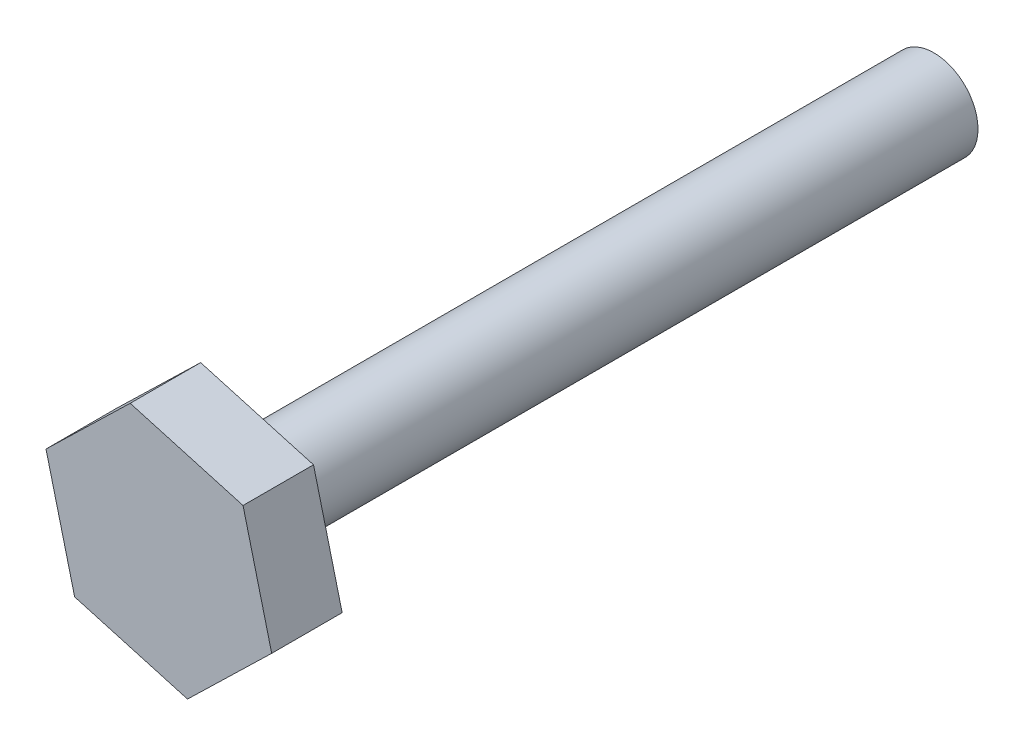
ISO-10303-21;
HEADER;
FILE_DESCRIPTION(('STEP AP214'),'2;1');
FILE_NAME('part.step','',(''),(''),'','','');
FILE_SCHEMA(('AUTOMOTIVE_DESIGN { 1 0 10303 214 1 1 1 1 }'));
ENDSEC;
DATA;
#1=APPLICATION_CONTEXT('core data for automotive mechanical design processes');
#2=APPLICATION_PROTOCOL_DEFINITION('international standard','automotive_design',2000,#1);
#3=PRODUCT_CONTEXT('',#1,'mechanical');
#4=PRODUCT('Part','Part','',(#3));
#5=PRODUCT_RELATED_PRODUCT_CATEGORY('part','',(#4));
#6=PRODUCT_DEFINITION_FORMATION('','',#4);
#7=PRODUCT_DEFINITION_CONTEXT('part definition',#1,'design');
#8=PRODUCT_DEFINITION('design','',#6,#7);
#9=PRODUCT_DEFINITION_SHAPE('','',#8);
#10=(LENGTH_UNIT() NAMED_UNIT(*) SI_UNIT(.MILLI.,.METRE.));
#11=(NAMED_UNIT(*) PLANE_ANGLE_UNIT() SI_UNIT($,.RADIAN.));
#12=(NAMED_UNIT(*) SI_UNIT($,.STERADIAN.) SOLID_ANGLE_UNIT());
#13=UNCERTAINTY_MEASURE_WITH_UNIT(LENGTH_MEASURE(1.E-05),#10,'distance_accuracy_value','');
#14=(GEOMETRIC_REPRESENTATION_CONTEXT(3) GLOBAL_UNCERTAINTY_ASSIGNED_CONTEXT((#13)) GLOBAL_UNIT_ASSIGNED_CONTEXT((#10,
#11,#12)) REPRESENTATION_CONTEXT('',''));
#15=CARTESIAN_POINT('',(0.,0.,0.));
#16=DIRECTION('',(0.,0.,1.));
#17=DIRECTION('',(1.,0.,0.));
#18=AXIS2_PLACEMENT_3D('',#15,#16,#17);
#19=CARTESIAN_POINT('',(0.,0.,20.));
#20=DIRECTION('',(0.,0.,-1.));
#21=DIRECTION('',(-1.,0.,0.));
#22=AXIS2_PLACEMENT_3D('',#19,#20,#21);
#23=CYLINDRICAL_SURFACE('',#22,1.25);
#24=CARTESIAN_POINT('',(0.,0.,20.));
#25=DIRECTION('',(0.,0.,1.));
#26=DIRECTION('',(1.,0.,0.));
#27=AXIS2_PLACEMENT_3D('',#24,#25,#26);
#28=CIRCLE('',#27,1.25);
#29=CARTESIAN_POINT('',(1.25,0.,20.));
#30=VERTEX_POINT('',#29);
#31=EDGE_CURVE('E11',#30,#30,#28,.T.);
#32=ORIENTED_EDGE('',*,*,#31,.F.);
#33=EDGE_LOOP('',(#32));
#34=FACE_BOUND('',#33,.T.);
#35=CARTESIAN_POINT('',(0.,0.,0.));
#36=DIRECTION('',(0.,0.,1.));
#37=DIRECTION('',(1.,0.,0.));
#38=AXIS2_PLACEMENT_3D('',#35,#36,#37);
#39=CIRCLE('',#38,1.25);
#40=CARTESIAN_POINT('',(1.25,0.,0.));
#41=VERTEX_POINT('',#40);
#42=EDGE_CURVE('E37',#41,#41,#39,.T.);
#43=ORIENTED_EDGE('',*,*,#42,.T.);
#44=EDGE_LOOP('',(#43));
#45=FACE_BOUND('',#44,.T.);
#46=ADVANCED_FACE('F34',(#34,#45),#23,.T.);
#47=CARTESIAN_POINT('',(0.,0.,0.));
#48=DIRECTION('',(0.,0.,1.));
#49=DIRECTION('',(1.,0.,0.));
#50=AXIS2_PLACEMENT_3D('',#47,#48,#49);
#51=PLANE('',#50);
#52=ORIENTED_EDGE('',*,*,#42,.F.);
#53=EDGE_LOOP('',(#52));
#54=FACE_BOUND('',#53,.T.);
#55=ADVANCED_FACE('F142',(#54),#51,.F.);
#56=CARTESIAN_POINT('',(0.,0.,20.));
#57=DIRECTION('',(0.,0.,1.));
#58=DIRECTION('',(1.,0.,0.));
#59=AXIS2_PLACEMENT_3D('',#56,#57,#58);
#60=PLANE('',#59);
#61=DIRECTION('',(-0.244196942198812,0.969725658844165,0.));
#62=VECTOR('',#61,1.);
#63=CARTESIAN_POINT('',(3.20276571956048,-0.910254396923229,20.));
#64=LINE('',#63,#62);
#65=CARTESIAN_POINT('',(3.20276571956048,-0.910254396923229,20.));
#66=VERTEX_POINT('',#65);
#67=CARTESIAN_POINT('',(2.38968629142224,2.31854927704771,20.));
#68=VERTEX_POINT('',#67);
#69=EDGE_CURVE('E119',#66,#68,#64,.T.);
#70=ORIENTED_EDGE('',*,*,#69,.F.);
#71=DIRECTION('',(0.717708584161243,0.696343584892734,0.));
#72=VECTOR('',#71,1.);
#73=CARTESIAN_POINT('',(0.81307942813824,-3.22880367397094,20.));
#74=LINE('',#73,#72);
#75=CARTESIAN_POINT('',(0.81307942813824,-3.22880367397094,20.));
#76=VERTEX_POINT('',#75);
#77=EDGE_CURVE('E79',#76,#66,#74,.T.);
#78=ORIENTED_EDGE('',*,*,#77,.F.);
#79=DIRECTION('',(0.961905526360055,-0.273382073951431,0.));
#80=VECTOR('',#79,1.);
#81=CARTESIAN_POINT('',(-2.38968629142224,-2.31854927704771,20.));
#82=LINE('',#81,#80);
#83=CARTESIAN_POINT('',(-2.38968629142224,-2.31854927704771,20.));
#84=VERTEX_POINT('',#83);
#85=EDGE_CURVE('E73',#84,#76,#82,.T.);
#86=ORIENTED_EDGE('',*,*,#85,.F.);
#87=DIRECTION('',(0.244196942198812,-0.969725658844165,0.));
#88=VECTOR('',#87,1.);
#89=CARTESIAN_POINT('',(-3.20276571956048,0.910254396923227,20.));
#90=LINE('',#89,#88);
#91=CARTESIAN_POINT('',(-3.20276571956048,0.910254396923227,20.));
#92=VERTEX_POINT('',#91);
#93=EDGE_CURVE('E109',#92,#84,#90,.T.);
#94=ORIENTED_EDGE('',*,*,#93,.F.);
#95=DIRECTION('',(-0.717708584161243,-0.696343584892734,0.));
#96=VECTOR('',#95,1.);
#97=CARTESIAN_POINT('',(-0.813079428138239,3.22880367397094,20.));
#98=LINE('',#97,#96);
#99=CARTESIAN_POINT('',(-0.813079428138239,3.22880367397094,20.));
#100=VERTEX_POINT('',#99);
#101=EDGE_CURVE('E124',#100,#92,#98,.T.);
#102=ORIENTED_EDGE('',*,*,#101,.F.);
#103=DIRECTION('',(-0.961905526360055,0.273382073951432,0.));
#104=VECTOR('',#103,1.);
#105=CARTESIAN_POINT('',(2.38968629142224,2.31854927704771,20.));
#106=LINE('',#105,#104);
#107=EDGE_CURVE('E122',#68,#100,#106,.T.);
#108=ORIENTED_EDGE('',*,*,#107,.F.);
#109=EDGE_LOOP('',(#70,#78,#86,#94,#102,#108));
#110=FACE_BOUND('',#109,.T.);
#111=ORIENTED_EDGE('',*,*,#31,.T.);
#112=EDGE_LOOP('',(#111));
#113=FACE_BOUND('',#112,.T.);
#114=ADVANCED_FACE('F144',(#110,#113),#60,.F.);
#115=CARTESIAN_POINT('',(3.20276571956048,-0.910254396923229,22.));
#116=DIRECTION('',(-0.969725658844165,-0.244196942198812,0.));
#117=DIRECTION('',(0.244196942198812,-0.969725658844165,0.));
#118=AXIS2_PLACEMENT_3D('',#115,#116,#117);
#119=PLANE('',#118);
#120=ORIENTED_EDGE('',*,*,#69,.T.);
#121=DIRECTION('',(0.,0.,-1.));
#122=VECTOR('',#121,1.);
#123=CARTESIAN_POINT('',(2.38968629142224,2.31854927704771,22.));
#124=LINE('',#123,#122);
#125=CARTESIAN_POINT('',(2.38968629142224,2.31854927704771,22.));
#126=VERTEX_POINT('',#125);
#127=EDGE_CURVE('E136',#126,#68,#124,.T.);
#128=ORIENTED_EDGE('',*,*,#127,.F.);
#129=DIRECTION('',(-0.244196942198812,0.969725658844165,0.));
#130=VECTOR('',#129,1.);
#131=CARTESIAN_POINT('',(3.20276571956048,-0.910254396923229,22.));
#132=LINE('',#131,#130);
#133=CARTESIAN_POINT('',(3.20276571956048,-0.910254396923229,22.));
#134=VERTEX_POINT('',#133);
#135=EDGE_CURVE('E129',#134,#126,#132,.T.);
#136=ORIENTED_EDGE('',*,*,#135,.F.);
#137=DIRECTION('',(0.,0.,-1.));
#138=VECTOR('',#137,1.);
#139=CARTESIAN_POINT('',(3.20276571956048,-0.910254396923229,22.));
#140=LINE('',#139,#138);
#141=EDGE_CURVE('E115',#134,#66,#140,.T.);
#142=ORIENTED_EDGE('',*,*,#141,.T.);
#143=EDGE_LOOP('',(#120,#128,#136,#142));
#144=FACE_BOUND('',#143,.T.);
#145=ADVANCED_FACE('F149',(#144),#119,.F.);
#146=CARTESIAN_POINT('',(2.38968629142224,2.31854927704771,22.));
#147=DIRECTION('',(-0.273382073951431,-0.961905526360055,0.));
#148=DIRECTION('',(0.961905526360055,-0.273382073951432,0.));
#149=AXIS2_PLACEMENT_3D('',#146,#147,#148);
#150=PLANE('',#149);
#151=ORIENTED_EDGE('',*,*,#107,.T.);
#152=DIRECTION('',(0.,0.,-1.));
#153=VECTOR('',#152,1.);
#154=CARTESIAN_POINT('',(-0.813079428138239,3.22880367397094,22.));
#155=LINE('',#154,#153);
#156=CARTESIAN_POINT('',(-0.813079428138239,3.22880367397094,22.));
#157=VERTEX_POINT('',#156);
#158=EDGE_CURVE('E133',#157,#100,#155,.T.);
#159=ORIENTED_EDGE('',*,*,#158,.F.);
#160=DIRECTION('',(-0.961905526360055,0.273382073951432,0.));
#161=VECTOR('',#160,1.);
#162=CARTESIAN_POINT('',(2.38968629142224,2.31854927704771,22.));
#163=LINE('',#162,#161);
#164=EDGE_CURVE('E88',#126,#157,#163,.T.);
#165=ORIENTED_EDGE('',*,*,#164,.F.);
#166=ORIENTED_EDGE('',*,*,#127,.T.);
#167=EDGE_LOOP('',(#151,#159,#165,#166));
#168=FACE_BOUND('',#167,.T.);
#169=ADVANCED_FACE('F156',(#168),#150,.F.);
#170=CARTESIAN_POINT('',(-0.813079428138239,3.22880367397094,22.));
#171=DIRECTION('',(0.696343584892734,-0.717708584161243,0.));
#172=DIRECTION('',(0.717708584161243,0.696343584892734,0.));
#173=AXIS2_PLACEMENT_3D('',#170,#171,#172);
#174=PLANE('',#173);
#175=ORIENTED_EDGE('',*,*,#101,.T.);
#176=DIRECTION('',(0.,0.,-1.));
#177=VECTOR('',#176,1.);
#178=CARTESIAN_POINT('',(-3.20276571956048,0.910254396923227,22.));
#179=LINE('',#178,#177);
#180=CARTESIAN_POINT('',(-3.20276571956048,0.910254396923227,22.));
#181=VERTEX_POINT('',#180);
#182=EDGE_CURVE('E110',#181,#92,#179,.T.);
#183=ORIENTED_EDGE('',*,*,#182,.F.);
#184=DIRECTION('',(-0.717708584161243,-0.696343584892734,0.));
#185=VECTOR('',#184,1.);
#186=CARTESIAN_POINT('',(-0.813079428138239,3.22880367397094,22.));
#187=LINE('',#186,#185);
#188=EDGE_CURVE('E101',#157,#181,#187,.T.);
#189=ORIENTED_EDGE('',*,*,#188,.F.);
#190=ORIENTED_EDGE('',*,*,#158,.T.);
#191=EDGE_LOOP('',(#175,#183,#189,#190));
#192=FACE_BOUND('',#191,.T.);
#193=ADVANCED_FACE('F160',(#192),#174,.F.);
#194=CARTESIAN_POINT('',(-3.20276571956048,0.910254396923227,22.));
#195=DIRECTION('',(0.969725658844165,0.244196942198812,0.));
#196=DIRECTION('',(-0.244196942198812,0.969725658844165,0.));
#197=AXIS2_PLACEMENT_3D('',#194,#195,#196);
#198=PLANE('',#197);
#199=ORIENTED_EDGE('',*,*,#93,.T.);
#200=DIRECTION('',(0.,0.,-1.));
#201=VECTOR('',#200,1.);
#202=CARTESIAN_POINT('',(-2.38968629142224,-2.31854927704771,22.));
#203=LINE('',#202,#201);
#204=CARTESIAN_POINT('',(-2.38968629142224,-2.31854927704771,22.));
#205=VERTEX_POINT('',#204);
#206=EDGE_CURVE('E106',#205,#84,#203,.T.);
#207=ORIENTED_EDGE('',*,*,#206,.F.);
#208=DIRECTION('',(0.244196942198812,-0.969725658844165,0.));
#209=VECTOR('',#208,1.);
#210=CARTESIAN_POINT('',(-3.20276571956048,0.910254396923227,22.));
#211=LINE('',#210,#209);
#212=EDGE_CURVE('E95',#181,#205,#211,.T.);
#213=ORIENTED_EDGE('',*,*,#212,.F.);
#214=ORIENTED_EDGE('',*,*,#182,.T.);
#215=EDGE_LOOP('',(#199,#207,#213,#214));
#216=FACE_BOUND('',#215,.T.);
#217=ADVANCED_FACE('F107',(#216),#198,.F.);
#218=CARTESIAN_POINT('',(-2.38968629142224,-2.31854927704771,22.));
#219=DIRECTION('',(0.273382073951431,0.961905526360055,0.));
#220=DIRECTION('',(-0.961905526360055,0.273382073951431,0.));
#221=AXIS2_PLACEMENT_3D('',#218,#219,#220);
#222=PLANE('',#221);
#223=ORIENTED_EDGE('',*,*,#85,.T.);
#224=DIRECTION('',(0.,0.,-1.));
#225=VECTOR('',#224,1.);
#226=CARTESIAN_POINT('',(0.81307942813824,-3.22880367397094,22.));
#227=LINE('',#226,#225);
#228=CARTESIAN_POINT('',(0.81307942813824,-3.22880367397094,22.));
#229=VERTEX_POINT('',#228);
#230=EDGE_CURVE('E111',#229,#76,#227,.T.);
#231=ORIENTED_EDGE('',*,*,#230,.F.);
#232=DIRECTION('',(0.961905526360055,-0.273382073951431,0.));
#233=VECTOR('',#232,1.);
#234=CARTESIAN_POINT('',(-2.38968629142224,-2.31854927704771,22.));
#235=LINE('',#234,#233);
#236=EDGE_CURVE('E99',#205,#229,#235,.T.);
#237=ORIENTED_EDGE('',*,*,#236,.F.);
#238=ORIENTED_EDGE('',*,*,#206,.T.);
#239=EDGE_LOOP('',(#223,#231,#237,#238));
#240=FACE_BOUND('',#239,.T.);
#241=ADVANCED_FACE('F113',(#240),#222,.F.);
#242=CARTESIAN_POINT('',(0.81307942813824,-3.22880367397094,22.));
#243=DIRECTION('',(-0.696343584892734,0.717708584161243,0.));
#244=DIRECTION('',(-0.717708584161243,-0.696343584892734,0.));
#245=AXIS2_PLACEMENT_3D('',#242,#243,#244);
#246=PLANE('',#245);
#247=ORIENTED_EDGE('',*,*,#77,.T.);
#248=ORIENTED_EDGE('',*,*,#141,.F.);
#249=DIRECTION('',(0.717708584161243,0.696343584892734,0.));
#250=VECTOR('',#249,1.);
#251=CARTESIAN_POINT('',(0.81307942813824,-3.22880367397094,22.));
#252=LINE('',#251,#250);
#253=EDGE_CURVE('E50',#229,#134,#252,.T.);
#254=ORIENTED_EDGE('',*,*,#253,.F.);
#255=ORIENTED_EDGE('',*,*,#230,.T.);
#256=EDGE_LOOP('',(#247,#248,#254,#255));
#257=FACE_BOUND('',#256,.T.);
#258=ADVANCED_FACE('F168',(#257),#246,.F.);
#259=CARTESIAN_POINT('',(0.,0.,22.));
#260=DIRECTION('',(0.,0.,1.));
#261=DIRECTION('',(1.,0.,0.));
#262=AXIS2_PLACEMENT_3D('',#259,#260,#261);
#263=PLANE('',#262);
#264=ORIENTED_EDGE('',*,*,#135,.T.);
#265=ORIENTED_EDGE('',*,*,#164,.T.);
#266=ORIENTED_EDGE('',*,*,#188,.T.);
#267=ORIENTED_EDGE('',*,*,#212,.T.);
#268=ORIENTED_EDGE('',*,*,#236,.T.);
#269=ORIENTED_EDGE('',*,*,#253,.T.);
#270=EDGE_LOOP('',(#264,#265,#266,#267,#268,#269));
#271=FACE_BOUND('',#270,.T.);
#272=ADVANCED_FACE('F97',(#271),#263,.T.);
#273=CLOSED_SHELL('',(#46,#55,#114,#145,#169,#193,#217,#241,#258,#272));
#274=MANIFOLD_SOLID_BREP('B2',#273);
#275=ADVANCED_BREP_SHAPE_REPRESENTATION('',(#18,#274),#14);
#276=SHAPE_DEFINITION_REPRESENTATION(#9,#275);
ENDSEC;
END-ISO-10303-21;
